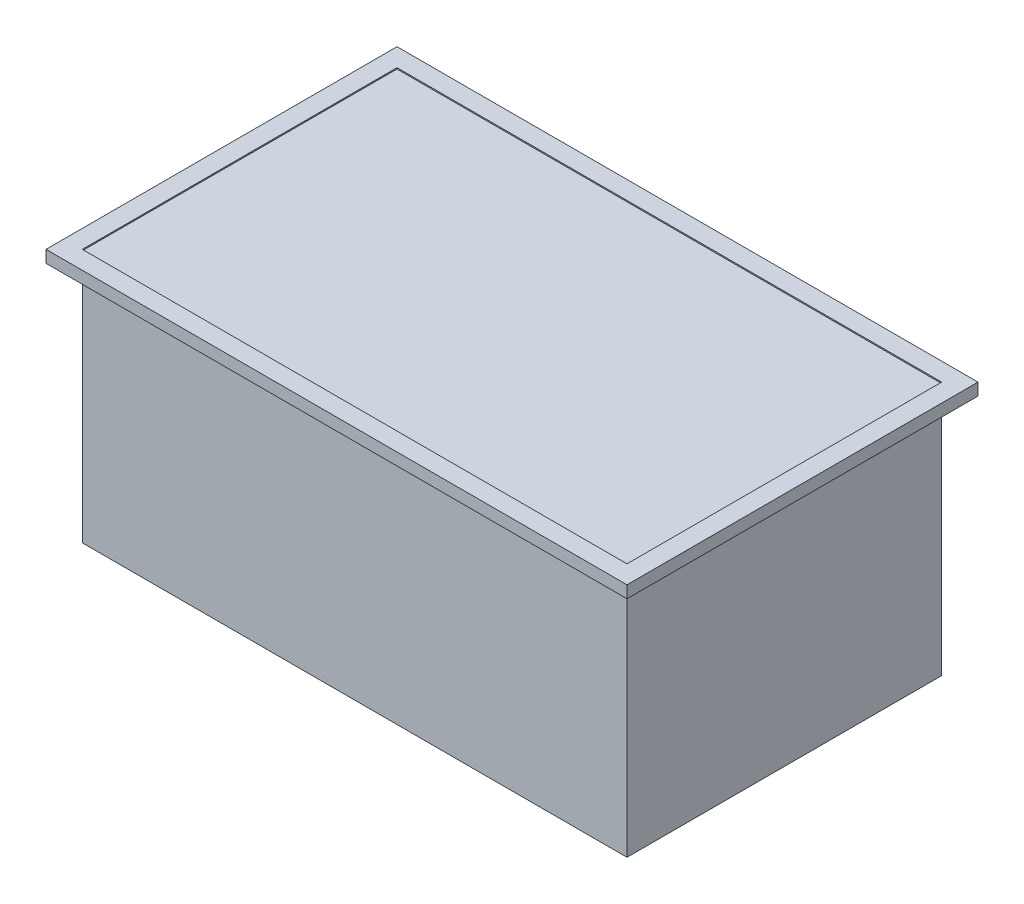
ISO-10303-21;
HEADER;
FILE_DESCRIPTION(('STEP AP214'),'2;1');
FILE_NAME('part.step','',(''),(''),'','','');
FILE_SCHEMA(('AUTOMOTIVE_DESIGN { 1 0 10303 214 1 1 1 1 }'));
ENDSEC;
DATA;
#1=APPLICATION_CONTEXT('core data for automotive mechanical design processes');
#2=APPLICATION_PROTOCOL_DEFINITION('international standard','automotive_design',2000,#1);
#3=PRODUCT_CONTEXT('',#1,'mechanical');
#4=PRODUCT('Part','Part','',(#3));
#5=PRODUCT_RELATED_PRODUCT_CATEGORY('part','',(#4));
#6=PRODUCT_DEFINITION_FORMATION('','',#4);
#7=PRODUCT_DEFINITION_CONTEXT('part definition',#1,'design');
#8=PRODUCT_DEFINITION('design','',#6,#7);
#9=PRODUCT_DEFINITION_SHAPE('','',#8);
#10=(LENGTH_UNIT() NAMED_UNIT(*) SI_UNIT(.MILLI.,.METRE.));
#11=(NAMED_UNIT(*) PLANE_ANGLE_UNIT() SI_UNIT($,.RADIAN.));
#12=(NAMED_UNIT(*) SI_UNIT($,.STERADIAN.) SOLID_ANGLE_UNIT());
#13=UNCERTAINTY_MEASURE_WITH_UNIT(LENGTH_MEASURE(1.E-05),#10,'distance_accuracy_value','');
#14=(GEOMETRIC_REPRESENTATION_CONTEXT(3) GLOBAL_UNCERTAINTY_ASSIGNED_CONTEXT((#13)) GLOBAL_UNIT_ASSIGNED_CONTEXT((#10,
#11,#12)) REPRESENTATION_CONTEXT('',''));
#15=CARTESIAN_POINT('',(0.,0.,0.));
#16=DIRECTION('',(0.,0.,1.));
#17=DIRECTION('',(1.,0.,0.));
#18=AXIS2_PLACEMENT_3D('',#15,#16,#17);
#19=CARTESIAN_POINT('',(22.5,20.,-13.));
#20=DIRECTION('',(-1.,0.,0.));
#21=DIRECTION('',(0.,0.,1.));
#22=AXIS2_PLACEMENT_3D('',#19,#20,#21);
#23=PLANE('',#22);
#24=DIRECTION('',(0.,0.,-1.));
#25=VECTOR('',#24,1.);
#26=CARTESIAN_POINT('',(22.5,0.,-13.));
#27=LINE('',#26,#25);
#28=CARTESIAN_POINT('',(22.5,0.,13.));
#29=VERTEX_POINT('',#28);
#30=CARTESIAN_POINT('',(22.5,0.,-13.));
#31=VERTEX_POINT('',#30);
#32=EDGE_CURVE('E203',#29,#31,#27,.T.);
#33=ORIENTED_EDGE('',*,*,#32,.T.);
#34=DIRECTION('',(0.,-1.,0.));
#35=VECTOR('',#34,1.);
#36=CARTESIAN_POINT('',(22.5,20.,-13.));
#37=LINE('',#36,#35);
#38=CARTESIAN_POINT('',(22.5,20.,-13.));
#39=VERTEX_POINT('',#38);
#40=EDGE_CURVE('E11',#39,#31,#37,.T.);
#41=ORIENTED_EDGE('',*,*,#40,.F.);
#42=DIRECTION('',(0.,0.,-1.));
#43=VECTOR('',#42,1.);
#44=CARTESIAN_POINT('',(22.5,20.,-13.));
#45=LINE('',#44,#43);
#46=CARTESIAN_POINT('',(22.5,20.,13.));
#47=VERTEX_POINT('',#46);
#48=EDGE_CURVE('E204',#47,#39,#45,.T.);
#49=ORIENTED_EDGE('',*,*,#48,.F.);
#50=DIRECTION('',(0.,-1.,0.));
#51=VECTOR('',#50,1.);
#52=CARTESIAN_POINT('',(22.5,20.,13.));
#53=LINE('',#52,#51);
#54=EDGE_CURVE('E214',#47,#29,#53,.T.);
#55=ORIENTED_EDGE('',*,*,#54,.T.);
#56=EDGE_LOOP('',(#33,#41,#49,#55));
#57=FACE_BOUND('',#56,.T.);
#58=ADVANCED_FACE('F37',(#57),#23,.F.);
#59=CARTESIAN_POINT('',(-22.5,20.,-13.));
#60=DIRECTION('',(0.,0.,1.));
#61=DIRECTION('',(1.,0.,0.));
#62=AXIS2_PLACEMENT_3D('',#59,#60,#61);
#63=PLANE('',#62);
#64=DIRECTION('',(-1.,0.,0.));
#65=VECTOR('',#64,1.);
#66=CARTESIAN_POINT('',(-22.5,0.,-13.));
#67=LINE('',#66,#65);
#68=CARTESIAN_POINT('',(-22.5,0.,-13.));
#69=VERTEX_POINT('',#68);
#70=EDGE_CURVE('E217',#31,#69,#67,.T.);
#71=ORIENTED_EDGE('',*,*,#70,.T.);
#72=DIRECTION('',(0.,-1.,0.));
#73=VECTOR('',#72,1.);
#74=CARTESIAN_POINT('',(-22.5,20.,-13.));
#75=LINE('',#74,#73);
#76=CARTESIAN_POINT('',(-22.5,20.,-13.));
#77=VERTEX_POINT('',#76);
#78=EDGE_CURVE('E44',#77,#69,#75,.T.);
#79=ORIENTED_EDGE('',*,*,#78,.F.);
#80=DIRECTION('',(-1.,0.,0.));
#81=VECTOR('',#80,1.);
#82=CARTESIAN_POINT('',(-22.5,20.,-13.));
#83=LINE('',#82,#81);
#84=EDGE_CURVE('E85',#39,#77,#83,.T.);
#85=ORIENTED_EDGE('',*,*,#84,.F.);
#86=ORIENTED_EDGE('',*,*,#40,.T.);
#87=EDGE_LOOP('',(#71,#79,#85,#86));
#88=FACE_BOUND('',#87,.T.);
#89=ADVANCED_FACE('F249',(#88),#63,.F.);
#90=CARTESIAN_POINT('',(-22.5,20.,-13.));
#91=DIRECTION('',(1.,0.,0.));
#92=DIRECTION('',(0.,0.,-1.));
#93=AXIS2_PLACEMENT_3D('',#90,#91,#92);
#94=PLANE('',#93);
#95=DIRECTION('',(0.,0.,1.));
#96=VECTOR('',#95,1.);
#97=CARTESIAN_POINT('',(-22.5,0.,-13.));
#98=LINE('',#97,#96);
#99=CARTESIAN_POINT('',(-22.5,0.,13.));
#100=VERTEX_POINT('',#99);
#101=EDGE_CURVE('E219',#69,#100,#98,.T.);
#102=ORIENTED_EDGE('',*,*,#101,.T.);
#103=DIRECTION('',(0.,-1.,0.));
#104=VECTOR('',#103,1.);
#105=CARTESIAN_POINT('',(-22.5,20.,13.));
#106=LINE('',#105,#104);
#107=CARTESIAN_POINT('',(-22.5,20.,13.));
#108=VERTEX_POINT('',#107);
#109=EDGE_CURVE('E60',#108,#100,#106,.T.);
#110=ORIENTED_EDGE('',*,*,#109,.F.);
#111=DIRECTION('',(0.,0.,1.));
#112=VECTOR('',#111,1.);
#113=CARTESIAN_POINT('',(-22.5,20.,-13.));
#114=LINE('',#113,#112);
#115=EDGE_CURVE('E208',#77,#108,#114,.T.);
#116=ORIENTED_EDGE('',*,*,#115,.F.);
#117=ORIENTED_EDGE('',*,*,#78,.T.);
#118=EDGE_LOOP('',(#102,#110,#116,#117));
#119=FACE_BOUND('',#118,.T.);
#120=ADVANCED_FACE('F225',(#119),#94,.F.);
#121=CARTESIAN_POINT('',(-22.5,20.,13.));
#122=DIRECTION('',(0.,0.,-1.));
#123=DIRECTION('',(-1.,0.,0.));
#124=AXIS2_PLACEMENT_3D('',#121,#122,#123);
#125=PLANE('',#124);
#126=DIRECTION('',(1.,0.,0.));
#127=VECTOR('',#126,1.);
#128=CARTESIAN_POINT('',(-22.5,0.,13.));
#129=LINE('',#128,#127);
#130=EDGE_CURVE('E80',#100,#29,#129,.T.);
#131=ORIENTED_EDGE('',*,*,#130,.T.);
#132=ORIENTED_EDGE('',*,*,#54,.F.);
#133=DIRECTION('',(1.,0.,0.));
#134=VECTOR('',#133,1.);
#135=CARTESIAN_POINT('',(-22.5,20.,13.));
#136=LINE('',#135,#134);
#137=EDGE_CURVE('E211',#108,#47,#136,.T.);
#138=ORIENTED_EDGE('',*,*,#137,.F.);
#139=ORIENTED_EDGE('',*,*,#109,.T.);
#140=EDGE_LOOP('',(#131,#132,#138,#139));
#141=FACE_BOUND('',#140,.T.);
#142=ADVANCED_FACE('F230',(#141),#125,.F.);
#143=CARTESIAN_POINT('',(0.,0.,0.));
#144=DIRECTION('',(0.,1.,0.));
#145=DIRECTION('',(0.,0.,1.));
#146=AXIS2_PLACEMENT_3D('',#143,#144,#145);
#147=PLANE('',#146);
#148=ORIENTED_EDGE('',*,*,#32,.F.);
#149=ORIENTED_EDGE('',*,*,#130,.F.);
#150=ORIENTED_EDGE('',*,*,#101,.F.);
#151=ORIENTED_EDGE('',*,*,#70,.F.);
#152=EDGE_LOOP('',(#148,#149,#150,#151));
#153=FACE_BOUND('',#152,.T.);
#154=ADVANCED_FACE('F228',(#153),#147,.F.);
#155=CARTESIAN_POINT('',(0.,20.,0.));
#156=DIRECTION('',(0.,1.,0.));
#157=DIRECTION('',(0.,0.,1.));
#158=AXIS2_PLACEMENT_3D('',#155,#156,#157);
#159=PLANE('',#158);
#160=DIRECTION('',(0.,0.,-1.));
#161=VECTOR('',#160,1.);
#162=CARTESIAN_POINT('',(24.,20.,-14.5));
#163=LINE('',#162,#161);
#164=CARTESIAN_POINT('',(24.,20.,14.5));
#165=VERTEX_POINT('',#164);
#166=CARTESIAN_POINT('',(24.,20.,-14.5));
#167=VERTEX_POINT('',#166);
#168=EDGE_CURVE('E170',#165,#167,#163,.T.);
#169=ORIENTED_EDGE('',*,*,#168,.F.);
#170=DIRECTION('',(1.,0.,0.));
#171=VECTOR('',#170,1.);
#172=CARTESIAN_POINT('',(-24.,20.,14.5));
#173=LINE('',#172,#171);
#174=CARTESIAN_POINT('',(-24.,20.,14.5));
#175=VERTEX_POINT('',#174);
#176=EDGE_CURVE('E178',#175,#165,#173,.T.);
#177=ORIENTED_EDGE('',*,*,#176,.F.);
#178=DIRECTION('',(0.,0.,1.));
#179=VECTOR('',#178,1.);
#180=CARTESIAN_POINT('',(-24.,20.,-14.5));
#181=LINE('',#180,#179);
#182=CARTESIAN_POINT('',(-24.,20.,-14.5));
#183=VERTEX_POINT('',#182);
#184=EDGE_CURVE('E189',#183,#175,#181,.T.);
#185=ORIENTED_EDGE('',*,*,#184,.F.);
#186=DIRECTION('',(-1.,0.,0.));
#187=VECTOR('',#186,1.);
#188=CARTESIAN_POINT('',(-24.,20.,-14.5));
#189=LINE('',#188,#187);
#190=EDGE_CURVE('E187',#167,#183,#189,.T.);
#191=ORIENTED_EDGE('',*,*,#190,.F.);
#192=EDGE_LOOP('',(#169,#177,#185,#191));
#193=FACE_BOUND('',#192,.T.);
#194=ORIENTED_EDGE('',*,*,#137,.T.);
#195=ORIENTED_EDGE('',*,*,#48,.T.);
#196=ORIENTED_EDGE('',*,*,#84,.T.);
#197=ORIENTED_EDGE('',*,*,#115,.T.);
#198=EDGE_LOOP('',(#194,#195,#196,#197));
#199=FACE_BOUND('',#198,.T.);
#200=ADVANCED_FACE('F232',(#193,#199),#159,.F.);
#201=CARTESIAN_POINT('',(24.,21.,-14.5));
#202=DIRECTION('',(-1.,0.,0.));
#203=DIRECTION('',(0.,0.,1.));
#204=AXIS2_PLACEMENT_3D('',#201,#202,#203);
#205=PLANE('',#204);
#206=ORIENTED_EDGE('',*,*,#168,.T.);
#207=DIRECTION('',(0.,-1.,0.));
#208=VECTOR('',#207,1.);
#209=CARTESIAN_POINT('',(24.,21.,-14.5));
#210=LINE('',#209,#208);
#211=CARTESIAN_POINT('',(24.,21.,-14.5));
#212=VERTEX_POINT('',#211);
#213=EDGE_CURVE('E200',#212,#167,#210,.T.);
#214=ORIENTED_EDGE('',*,*,#213,.F.);
#215=DIRECTION('',(0.,0.,-1.));
#216=VECTOR('',#215,1.);
#217=CARTESIAN_POINT('',(24.,21.,-14.5));
#218=LINE('',#217,#216);
#219=CARTESIAN_POINT('',(24.,21.,14.5));
#220=VERTEX_POINT('',#219);
#221=EDGE_CURVE('E174',#220,#212,#218,.T.);
#222=ORIENTED_EDGE('',*,*,#221,.F.);
#223=DIRECTION('',(0.,-1.,0.));
#224=VECTOR('',#223,1.);
#225=CARTESIAN_POINT('',(24.,21.,14.5));
#226=LINE('',#225,#224);
#227=EDGE_CURVE('E184',#220,#165,#226,.T.);
#228=ORIENTED_EDGE('',*,*,#227,.T.);
#229=EDGE_LOOP('',(#206,#214,#222,#228));
#230=FACE_BOUND('',#229,.T.);
#231=ADVANCED_FACE('F234',(#230),#205,.F.);
#232=CARTESIAN_POINT('',(-24.,21.,-14.5));
#233=DIRECTION('',(0.,0.,1.));
#234=DIRECTION('',(1.,0.,0.));
#235=AXIS2_PLACEMENT_3D('',#232,#233,#234);
#236=PLANE('',#235);
#237=ORIENTED_EDGE('',*,*,#190,.T.);
#238=DIRECTION('',(0.,-1.,0.));
#239=VECTOR('',#238,1.);
#240=CARTESIAN_POINT('',(-24.,21.,-14.5));
#241=LINE('',#240,#239);
#242=CARTESIAN_POINT('',(-24.,21.,-14.5));
#243=VERTEX_POINT('',#242);
#244=EDGE_CURVE('E197',#243,#183,#241,.T.);
#245=ORIENTED_EDGE('',*,*,#244,.F.);
#246=DIRECTION('',(-1.,0.,0.));
#247=VECTOR('',#246,1.);
#248=CARTESIAN_POINT('',(-24.,21.,-14.5));
#249=LINE('',#248,#247);
#250=EDGE_CURVE('E177',#212,#243,#249,.T.);
#251=ORIENTED_EDGE('',*,*,#250,.F.);
#252=ORIENTED_EDGE('',*,*,#213,.T.);
#253=EDGE_LOOP('',(#237,#245,#251,#252));
#254=FACE_BOUND('',#253,.T.);
#255=ADVANCED_FACE('F241',(#254),#236,.F.);
#256=CARTESIAN_POINT('',(-24.,21.,-14.5));
#257=DIRECTION('',(1.,0.,0.));
#258=DIRECTION('',(0.,0.,-1.));
#259=AXIS2_PLACEMENT_3D('',#256,#257,#258);
#260=PLANE('',#259);
#261=ORIENTED_EDGE('',*,*,#184,.T.);
#262=DIRECTION('',(0.,-1.,0.));
#263=VECTOR('',#262,1.);
#264=CARTESIAN_POINT('',(-24.,21.,14.5));
#265=LINE('',#264,#263);
#266=CARTESIAN_POINT('',(-24.,21.,14.5));
#267=VERTEX_POINT('',#266);
#268=EDGE_CURVE('E194',#267,#175,#265,.T.);
#269=ORIENTED_EDGE('',*,*,#268,.F.);
#270=DIRECTION('',(0.,0.,1.));
#271=VECTOR('',#270,1.);
#272=CARTESIAN_POINT('',(-24.,21.,-14.5));
#273=LINE('',#272,#271);
#274=EDGE_CURVE('E180',#243,#267,#273,.T.);
#275=ORIENTED_EDGE('',*,*,#274,.F.);
#276=ORIENTED_EDGE('',*,*,#244,.T.);
#277=EDGE_LOOP('',(#261,#269,#275,#276));
#278=FACE_BOUND('',#277,.T.);
#279=ADVANCED_FACE('F262',(#278),#260,.F.);
#280=CARTESIAN_POINT('',(-24.,21.,14.5));
#281=DIRECTION('',(0.,0.,-1.));
#282=DIRECTION('',(-1.,0.,0.));
#283=AXIS2_PLACEMENT_3D('',#280,#281,#282);
#284=PLANE('',#283);
#285=ORIENTED_EDGE('',*,*,#176,.T.);
#286=ORIENTED_EDGE('',*,*,#227,.F.);
#287=DIRECTION('',(1.,0.,0.));
#288=VECTOR('',#287,1.);
#289=CARTESIAN_POINT('',(-24.,21.,14.5));
#290=LINE('',#289,#288);
#291=EDGE_CURVE('E182',#267,#220,#290,.T.);
#292=ORIENTED_EDGE('',*,*,#291,.F.);
#293=ORIENTED_EDGE('',*,*,#268,.T.);
#294=EDGE_LOOP('',(#285,#286,#292,#293));
#295=FACE_BOUND('',#294,.T.);
#296=ADVANCED_FACE('F265',(#295),#284,.F.);
#297=CARTESIAN_POINT('',(0.,21.,0.));
#298=DIRECTION('',(0.,1.,0.));
#299=DIRECTION('',(0.,0.,1.));
#300=AXIS2_PLACEMENT_3D('',#297,#298,#299);
#301=PLANE('',#300);
#302=DIRECTION('',(0.,0.,-1.));
#303=VECTOR('',#302,1.);
#304=CARTESIAN_POINT('',(22.5,21.,-13.));
#305=LINE('',#304,#303);
#306=CARTESIAN_POINT('',(22.5,21.,13.));
#307=VERTEX_POINT('',#306);
#308=CARTESIAN_POINT('',(22.5,21.,-13.));
#309=VERTEX_POINT('',#308);
#310=EDGE_CURVE('E51',#307,#309,#305,.T.);
#311=ORIENTED_EDGE('',*,*,#310,.F.);
#312=DIRECTION('',(1.,0.,0.));
#313=VECTOR('',#312,1.);
#314=CARTESIAN_POINT('',(-22.5,21.,13.));
#315=LINE('',#314,#313);
#316=CARTESIAN_POINT('',(-22.5,21.,13.));
#317=VERTEX_POINT('',#316);
#318=EDGE_CURVE('E155',#317,#307,#315,.T.);
#319=ORIENTED_EDGE('',*,*,#318,.F.);
#320=DIRECTION('',(0.,0.,1.));
#321=VECTOR('',#320,1.);
#322=CARTESIAN_POINT('',(-22.5,21.,-13.));
#323=LINE('',#322,#321);
#324=CARTESIAN_POINT('',(-22.5,21.,-13.));
#325=VERTEX_POINT('',#324);
#326=EDGE_CURVE('E158',#325,#317,#323,.T.);
#327=ORIENTED_EDGE('',*,*,#326,.F.);
#328=DIRECTION('',(-1.,0.,0.));
#329=VECTOR('',#328,1.);
#330=CARTESIAN_POINT('',(-22.5,21.,-13.));
#331=LINE('',#330,#329);
#332=EDGE_CURVE('E164',#309,#325,#331,.T.);
#333=ORIENTED_EDGE('',*,*,#332,.F.);
#334=EDGE_LOOP('',(#311,#319,#327,#333));
#335=FACE_BOUND('',#334,.T.);
#336=ORIENTED_EDGE('',*,*,#221,.T.);
#337=ORIENTED_EDGE('',*,*,#250,.T.);
#338=ORIENTED_EDGE('',*,*,#274,.T.);
#339=ORIENTED_EDGE('',*,*,#291,.T.);
#340=EDGE_LOOP('',(#336,#337,#338,#339));
#341=FACE_BOUND('',#340,.T.);
#342=ADVANCED_FACE('F268',(#335,#341),#301,.T.);
#343=CARTESIAN_POINT('',(22.5,20.9,-13.));
#344=DIRECTION('',(1.,0.,0.));
#345=DIRECTION('',(0.,0.,-1.));
#346=AXIS2_PLACEMENT_3D('',#343,#344,#345);
#347=PLANE('',#346);
#348=ORIENTED_EDGE('',*,*,#310,.T.);
#349=DIRECTION('',(0.,1.,0.));
#350=VECTOR('',#349,1.);
#351=CARTESIAN_POINT('',(22.5,20.9,-13.));
#352=LINE('',#351,#350);
#353=CARTESIAN_POINT('',(22.5,20.9,-13.));
#354=VERTEX_POINT('',#353);
#355=EDGE_CURVE('E133',#354,#309,#352,.T.);
#356=ORIENTED_EDGE('',*,*,#355,.F.);
#357=DIRECTION('',(0.,0.,-1.));
#358=VECTOR('',#357,1.);
#359=CARTESIAN_POINT('',(22.5,20.9,-13.));
#360=LINE('',#359,#358);
#361=CARTESIAN_POINT('',(22.5,20.9,13.));
#362=VERTEX_POINT('',#361);
#363=EDGE_CURVE('E137',#362,#354,#360,.T.);
#364=ORIENTED_EDGE('',*,*,#363,.F.);
#365=DIRECTION('',(0.,1.,0.));
#366=VECTOR('',#365,1.);
#367=CARTESIAN_POINT('',(22.5,20.9,13.));
#368=LINE('',#367,#366);
#369=EDGE_CURVE('E168',#362,#307,#368,.T.);
#370=ORIENTED_EDGE('',*,*,#369,.T.);
#371=EDGE_LOOP('',(#348,#356,#364,#370));
#372=FACE_BOUND('',#371,.T.);
#373=ADVANCED_FACE('F135',(#372),#347,.F.);
#374=CARTESIAN_POINT('',(-22.5,20.9,13.));
#375=DIRECTION('',(0.,0.,1.));
#376=DIRECTION('',(1.,0.,0.));
#377=AXIS2_PLACEMENT_3D('',#374,#375,#376);
#378=PLANE('',#377);
#379=ORIENTED_EDGE('',*,*,#318,.T.);
#380=ORIENTED_EDGE('',*,*,#369,.F.);
#381=DIRECTION('',(1.,0.,0.));
#382=VECTOR('',#381,1.);
#383=CARTESIAN_POINT('',(-22.5,20.9,13.));
#384=LINE('',#383,#382);
#385=CARTESIAN_POINT('',(-22.5,20.9,13.));
#386=VERTEX_POINT('',#385);
#387=EDGE_CURVE('E143',#386,#362,#384,.T.);
#388=ORIENTED_EDGE('',*,*,#387,.F.);
#389=DIRECTION('',(0.,1.,0.));
#390=VECTOR('',#389,1.);
#391=CARTESIAN_POINT('',(-22.5,20.9,13.));
#392=LINE('',#391,#390);
#393=EDGE_CURVE('E171',#386,#317,#392,.T.);
#394=ORIENTED_EDGE('',*,*,#393,.T.);
#395=EDGE_LOOP('',(#379,#380,#388,#394));
#396=FACE_BOUND('',#395,.T.);
#397=ADVANCED_FACE('F287',(#396),#378,.F.);
#398=CARTESIAN_POINT('',(-22.5,20.9,-13.));
#399=DIRECTION('',(-1.,0.,0.));
#400=DIRECTION('',(0.,0.,1.));
#401=AXIS2_PLACEMENT_3D('',#398,#399,#400);
#402=PLANE('',#401);
#403=ORIENTED_EDGE('',*,*,#326,.T.);
#404=ORIENTED_EDGE('',*,*,#393,.F.);
#405=DIRECTION('',(0.,0.,1.));
#406=VECTOR('',#405,1.);
#407=CARTESIAN_POINT('',(-22.5,20.9,-13.));
#408=LINE('',#407,#406);
#409=CARTESIAN_POINT('',(-22.5,20.9,-13.));
#410=VERTEX_POINT('',#409);
#411=EDGE_CURVE('E151',#410,#386,#408,.T.);
#412=ORIENTED_EDGE('',*,*,#411,.F.);
#413=DIRECTION('',(0.,1.,0.));
#414=VECTOR('',#413,1.);
#415=CARTESIAN_POINT('',(-22.5,20.9,-13.));
#416=LINE('',#415,#414);
#417=EDGE_CURVE('E142',#410,#325,#416,.T.);
#418=ORIENTED_EDGE('',*,*,#417,.T.);
#419=EDGE_LOOP('',(#403,#404,#412,#418));
#420=FACE_BOUND('',#419,.T.);
#421=ADVANCED_FACE('F292',(#420),#402,.F.);
#422=CARTESIAN_POINT('',(-22.5,20.9,-13.));
#423=DIRECTION('',(0.,0.,-1.));
#424=DIRECTION('',(-1.,0.,0.));
#425=AXIS2_PLACEMENT_3D('',#422,#423,#424);
#426=PLANE('',#425);
#427=ORIENTED_EDGE('',*,*,#332,.T.);
#428=ORIENTED_EDGE('',*,*,#417,.F.);
#429=DIRECTION('',(-1.,0.,0.));
#430=VECTOR('',#429,1.);
#431=CARTESIAN_POINT('',(-22.5,20.9,-13.));
#432=LINE('',#431,#430);
#433=EDGE_CURVE('E146',#354,#410,#432,.T.);
#434=ORIENTED_EDGE('',*,*,#433,.F.);
#435=ORIENTED_EDGE('',*,*,#355,.T.);
#436=EDGE_LOOP('',(#427,#428,#434,#435));
#437=FACE_BOUND('',#436,.T.);
#438=ADVANCED_FACE('F147',(#437),#426,.F.);
#439=CARTESIAN_POINT('',(0.,20.9,0.));
#440=DIRECTION('',(0.,1.,0.));
#441=DIRECTION('',(0.,0.,1.));
#442=AXIS2_PLACEMENT_3D('',#439,#440,#441);
#443=PLANE('',#442);
#444=ORIENTED_EDGE('',*,*,#363,.T.);
#445=ORIENTED_EDGE('',*,*,#433,.T.);
#446=ORIENTED_EDGE('',*,*,#411,.T.);
#447=ORIENTED_EDGE('',*,*,#387,.T.);
#448=EDGE_LOOP('',(#444,#445,#446,#447));
#449=FACE_BOUND('',#448,.T.);
#450=ADVANCED_FACE('F153',(#449),#443,.T.);
#451=CLOSED_SHELL('',(#58,#89,#120,#142,#154,#200,#231,#255,#279,#296,#342,#373,#397,#421,#438,#450));
#452=MANIFOLD_SOLID_BREP('B2',#451);
#453=ADVANCED_BREP_SHAPE_REPRESENTATION('',(#18,#452),#14);
#454=SHAPE_DEFINITION_REPRESENTATION(#9,#453);
ENDSEC;
END-ISO-10303-21;
